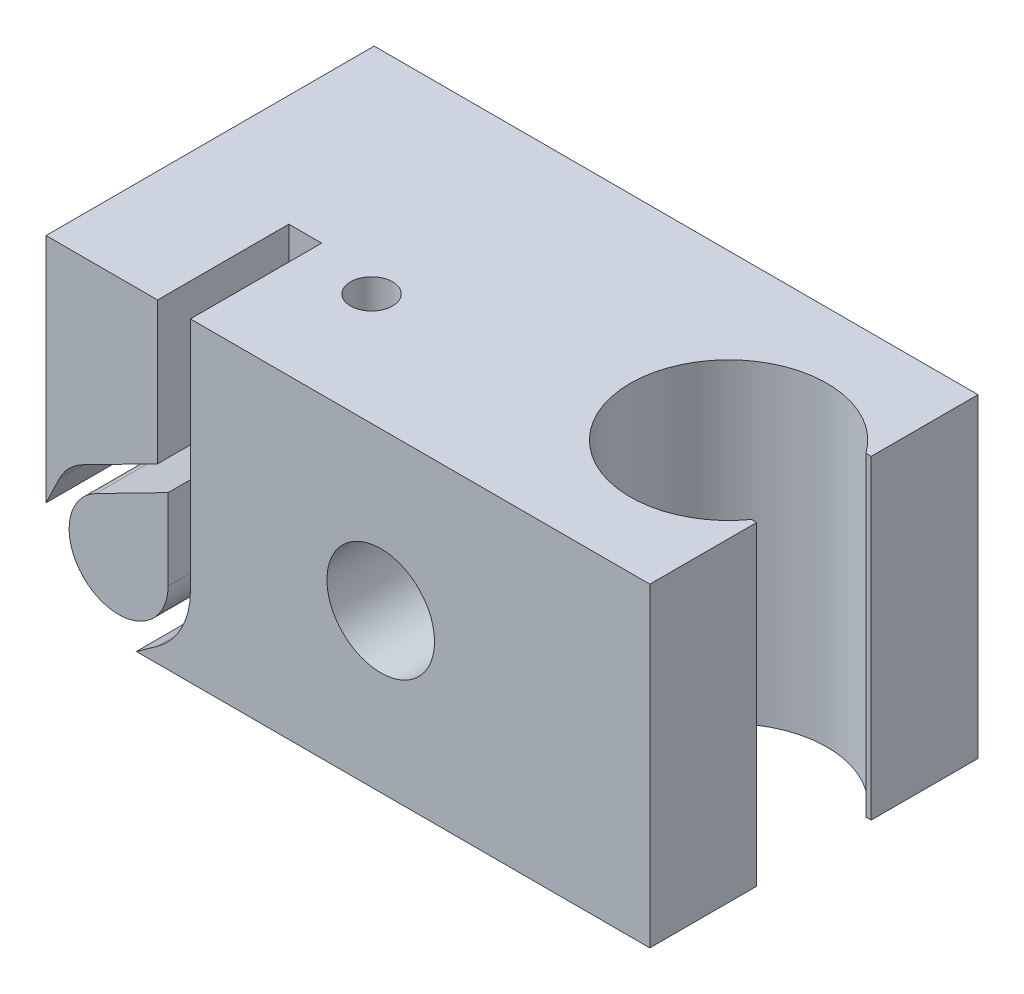
ISO-10303-21;
HEADER;
FILE_DESCRIPTION(('STEP AP214'),'2;1');
FILE_NAME('part.step','',(''),(''),'','','');
FILE_SCHEMA(('AUTOMOTIVE_DESIGN { 1 0 10303 214 1 1 1 1 }'));
ENDSEC;
DATA;
#1=APPLICATION_CONTEXT('core data for automotive mechanical design processes');
#2=APPLICATION_PROTOCOL_DEFINITION('international standard','automotive_design',2000,#1);
#3=PRODUCT_CONTEXT('',#1,'mechanical');
#4=PRODUCT('Part','Part','',(#3));
#5=PRODUCT_RELATED_PRODUCT_CATEGORY('part','',(#4));
#6=PRODUCT_DEFINITION_FORMATION('','',#4);
#7=PRODUCT_DEFINITION_CONTEXT('part definition',#1,'design');
#8=PRODUCT_DEFINITION('design','',#6,#7);
#9=PRODUCT_DEFINITION_SHAPE('','',#8);
#10=(LENGTH_UNIT() NAMED_UNIT(*) SI_UNIT(.MILLI.,.METRE.));
#11=(NAMED_UNIT(*) PLANE_ANGLE_UNIT() SI_UNIT($,.RADIAN.));
#12=(NAMED_UNIT(*) SI_UNIT($,.STERADIAN.) SOLID_ANGLE_UNIT());
#13=UNCERTAINTY_MEASURE_WITH_UNIT(LENGTH_MEASURE(1.E-05),#10,'distance_accuracy_value','');
#14=(GEOMETRIC_REPRESENTATION_CONTEXT(3) GLOBAL_UNCERTAINTY_ASSIGNED_CONTEXT((#13)) GLOBAL_UNIT_ASSIGNED_CONTEXT((#10,
#11,#12)) REPRESENTATION_CONTEXT('',''));
#15=CARTESIAN_POINT('',(0.,0.,0.));
#16=DIRECTION('',(0.,0.,1.));
#17=DIRECTION('',(1.,0.,0.));
#18=AXIS2_PLACEMENT_3D('',#15,#16,#17);
#19=CARTESIAN_POINT('',(0.,0.,2.5));
#20=DIRECTION('',(0.,0.,-1.));
#21=DIRECTION('',(-1.,0.,0.));
#22=AXIS2_PLACEMENT_3D('',#19,#20,#21);
#23=PLANE('',#22);
#24=DIRECTION('',(0.,1.,0.));
#25=VECTOR('',#24,1.);
#26=CARTESIAN_POINT('',(-31.,24.,2.5));
#27=LINE('',#26,#25);
#28=CARTESIAN_POINT('',(-31.,13.19,2.5));
#29=VERTEX_POINT('',#28);
#30=CARTESIAN_POINT('',(-31.,24.,2.5));
#31=VERTEX_POINT('',#30);
#32=EDGE_CURVE('E257',#29,#31,#27,.T.);
#33=ORIENTED_EDGE('',*,*,#32,.F.);
#34=DIRECTION('',(0.890531972902744,0.454920658178924,0.));
#35=VECTOR('',#34,1.);
#36=CARTESIAN_POINT('',(-31.,13.19,2.5));
#37=LINE('',#36,#35);
#38=CARTESIAN_POINT('',(-36.71,10.2730952315675,2.5));
#39=VERTEX_POINT('',#38);
#40=EDGE_CURVE('E262',#39,#29,#37,.T.);
#41=ORIENTED_EDGE('',*,*,#40,.F.);
#42=CARTESIAN_POINT('',(-34.8903173672843,6.71096733995649,2.5));
#43=DIRECTION('',(0.,0.,-1.));
#44=DIRECTION('',(1.,0.,0.));
#45=AXIS2_PLACEMENT_3D('',#42,#43,#44);
#46=CIRCLE('',#45,4.);
#47=CARTESIAN_POINT('',(-38.4926861378942,8.4496275254254,2.5));
#48=VERTEX_POINT('',#47);
#49=EDGE_CURVE('E278',#48,#39,#46,.T.);
#50=ORIENTED_EDGE('',*,*,#49,.F.);
#51=DIRECTION('',(0.434665046367225,0.900592192652467,0.));
#52=VECTOR('',#51,1.);
#53=CARTESIAN_POINT('',(-38.4926861378942,8.4496275254254,2.5));
#54=LINE('',#53,#52);
#55=CARTESIAN_POINT('',(-39.5,6.3625514944793,2.5));
#56=VERTEX_POINT('',#55);
#57=EDGE_CURVE('E276',#56,#48,#54,.T.);
#58=ORIENTED_EDGE('',*,*,#57,.F.);
#59=DIRECTION('',(0.,1.,0.));
#60=VECTOR('',#59,1.);
#61=CARTESIAN_POINT('',(-39.5,24.,2.50000000000001));
#62=LINE('',#61,#60);
#63=CARTESIAN_POINT('',(-39.5,0.,2.50000000000001));
#64=VERTEX_POINT('',#63);
#65=EDGE_CURVE('E323',#64,#56,#62,.T.);
#66=ORIENTED_EDGE('',*,*,#65,.F.);
#67=DIRECTION('',(-1.,0.,0.));
#68=VECTOR('',#67,1.);
#69=CARTESIAN_POINT('',(-20.,0.,2.5));
#70=LINE('',#69,#68);
#71=CARTESIAN_POINT('',(-32.618157490589,0.,2.5));
#72=VERTEX_POINT('',#71);
#73=EDGE_CURVE('E321',#72,#64,#70,.T.);
#74=ORIENTED_EDGE('',*,*,#73,.F.);
#75=DIRECTION('',(-0.814122037579976,-0.580693815987933,0.));
#76=VECTOR('',#75,1.);
#77=CARTESIAN_POINT('',(-31.0158371040724,1.14289688367537,2.5));
#78=LINE('',#77,#76);
#79=CARTESIAN_POINT('',(-31.0158371040724,1.14289688367537,2.5));
#80=VERTEX_POINT('',#79);
#81=EDGE_CURVE('E297',#80,#72,#78,.T.);
#82=ORIENTED_EDGE('',*,*,#81,.F.);
#83=CARTESIAN_POINT('',(-34.5,6.02762910915523,2.5));
#84=DIRECTION('',(0.,0.,-1.));
#85=DIRECTION('',(1.,0.,0.));
#86=AXIS2_PLACEMENT_3D('',#83,#84,#85);
#87=CIRCLE('',#86,6.);
#88=CARTESIAN_POINT('',(-28.5,6.02762910915523,2.5));
#89=VERTEX_POINT('',#88);
#90=EDGE_CURVE('E304',#89,#80,#87,.T.);
#91=ORIENTED_EDGE('',*,*,#90,.F.);
#92=DIRECTION('',(0.,-1.,0.));
#93=VECTOR('',#92,1.);
#94=CARTESIAN_POINT('',(-28.5,24.,2.5));
#95=LINE('',#94,#93);
#96=CARTESIAN_POINT('',(-28.5,24.,2.5));
#97=VERTEX_POINT('',#96);
#98=EDGE_CURVE('E293',#97,#89,#95,.T.);
#99=ORIENTED_EDGE('',*,*,#98,.F.);
#100=DIRECTION('',(1.,0.,0.));
#101=VECTOR('',#100,1.);
#102=CARTESIAN_POINT('',(-20.,24.,2.5));
#103=LINE('',#102,#101);
#104=EDGE_CURVE('E326',#31,#97,#103,.T.);
#105=ORIENTED_EDGE('',*,*,#104,.F.);
#106=EDGE_LOOP('',(#33,#41,#50,#58,#66,#74,#82,#91,#99,#105));
#107=FACE_BOUND('',#106,.T.);
#108=CARTESIAN_POINT('',(-33.97,5.5304048789427,2.5));
#109=DIRECTION('',(0.,0.,1.));
#110=DIRECTION('',(1.,0.,0.));
#111=AXIS2_PLACEMENT_3D('',#108,#109,#110);
#112=CIRCLE('',#111,3.77);
#113=CARTESIAN_POINT('',(-35.6850508813345,8.88771041678605,2.5));
#114=VERTEX_POINT('',#113);
#115=CARTESIAN_POINT('',(-30.2,5.5304048789427,2.5));
#116=VERTEX_POINT('',#115);
#117=EDGE_CURVE('E232',#114,#116,#112,.T.);
#118=ORIENTED_EDGE('',*,*,#117,.F.);
#119=DIRECTION('',(-0.890531972902744,-0.454920658178925,0.));
#120=VECTOR('',#119,1.);
#121=CARTESIAN_POINT('',(-30.2,11.6897018477598,2.5));
#122=LINE('',#121,#120);
#123=CARTESIAN_POINT('',(-30.2,11.6897018477598,2.5));
#124=VERTEX_POINT('',#123);
#125=EDGE_CURVE('E237',#124,#114,#122,.T.);
#126=ORIENTED_EDGE('',*,*,#125,.F.);
#127=DIRECTION('',(0.,1.,0.));
#128=VECTOR('',#127,1.);
#129=CARTESIAN_POINT('',(-30.2,5.5304048789427,2.5));
#130=LINE('',#129,#128);
#131=EDGE_CURVE('E244',#116,#124,#130,.T.);
#132=ORIENTED_EDGE('',*,*,#131,.F.);
#133=EDGE_LOOP('',(#118,#126,#132));
#134=FACE_BOUND('',#133,.T.);
#135=ADVANCED_FACE('F39',(#107,#134),#23,.F.);
#136=CARTESIAN_POINT('',(0.,24.,-12.5));
#137=DIRECTION('',(0.,0.,-1.));
#138=DIRECTION('',(-1.,0.,0.));
#139=AXIS2_PLACEMENT_3D('',#136,#137,#138);
#140=PLANE('',#139);
#141=CARTESIAN_POINT('',(-14.,12.,-12.5));
#142=DIRECTION('',(0.,0.,-1.));
#143=DIRECTION('',(-1.,0.,0.));
#144=AXIS2_PLACEMENT_3D('',#141,#142,#143);
#145=CIRCLE('',#144,4.1);
#146=CARTESIAN_POINT('',(-18.1,12.,-12.5));
#147=VERTEX_POINT('',#146);
#148=EDGE_CURVE('E339',#147,#147,#145,.T.);
#149=ORIENTED_EDGE('',*,*,#148,.F.);
#150=EDGE_LOOP('',(#149));
#151=FACE_BOUND('',#150,.T.);
#152=DIRECTION('',(0.,-1.,0.));
#153=VECTOR('',#152,1.);
#154=CARTESIAN_POINT('',(6.5,24.,-12.5));
#155=LINE('',#154,#153);
#156=CARTESIAN_POINT('',(6.5,24.,-12.5));
#157=VERTEX_POINT('',#156);
#158=CARTESIAN_POINT('',(6.5,0.,-12.5));
#159=VERTEX_POINT('',#158);
#160=EDGE_CURVE('E368',#157,#159,#155,.T.);
#161=ORIENTED_EDGE('',*,*,#160,.T.);
#162=DIRECTION('',(1.,0.,0.));
#163=VECTOR('',#162,1.);
#164=CARTESIAN_POINT('',(0.,0.,-12.5));
#165=LINE('',#164,#163);
#166=CARTESIAN_POINT('',(-39.5,0.,-12.5));
#167=VERTEX_POINT('',#166);
#168=EDGE_CURVE('E388',#167,#159,#165,.T.);
#169=ORIENTED_EDGE('',*,*,#168,.F.);
#170=DIRECTION('',(0.,1.,0.));
#171=VECTOR('',#170,1.);
#172=CARTESIAN_POINT('',(-39.5,24.,-12.5));
#173=LINE('',#172,#171);
#174=CARTESIAN_POINT('',(-39.5,24.,-12.5));
#175=VERTEX_POINT('',#174);
#176=EDGE_CURVE('E320',#167,#175,#173,.T.);
#177=ORIENTED_EDGE('',*,*,#176,.T.);
#178=DIRECTION('',(1.,0.,0.));
#179=VECTOR('',#178,1.);
#180=CARTESIAN_POINT('',(0.,24.,-12.5));
#181=LINE('',#180,#179);
#182=EDGE_CURVE('E48',#175,#157,#181,.T.);
#183=ORIENTED_EDGE('',*,*,#182,.T.);
#184=EDGE_LOOP('',(#161,#169,#177,#183));
#185=FACE_BOUND('',#184,.T.);
#186=ADVANCED_FACE('F421',(#151,#185),#140,.T.);
#187=CARTESIAN_POINT('',(0.,24.,0.));
#188=DIRECTION('',(0.,-1.,0.));
#189=DIRECTION('',(0.,0.,-1.));
#190=AXIS2_PLACEMENT_3D('',#187,#188,#189);
#191=CYLINDRICAL_SURFACE('',#190,7.5);
#192=DIRECTION('',(0.,-1.,0.));
#193=VECTOR('',#192,1.);
#194=CARTESIAN_POINT('',(6.1,24.,-4.36348484585429));
#195=LINE('',#194,#193);
#196=CARTESIAN_POINT('',(6.1,24.,-4.36348484585429));
#197=VERTEX_POINT('',#196);
#198=CARTESIAN_POINT('',(6.1,0.,-4.36348484585429));
#199=VERTEX_POINT('',#198);
#200=EDGE_CURVE('E374',#197,#199,#195,.T.);
#201=ORIENTED_EDGE('',*,*,#200,.F.);
#202=CARTESIAN_POINT('',(0.,24.,0.));
#203=DIRECTION('',(0.,1.,0.));
#204=DIRECTION('',(0.,0.,1.));
#205=AXIS2_PLACEMENT_3D('',#202,#203,#204);
#206=CIRCLE('',#205,7.5);
#207=CARTESIAN_POINT('',(6.1,24.,4.36348484585429));
#208=VERTEX_POINT('',#207);
#209=EDGE_CURVE('E382',#197,#208,#206,.T.);
#210=ORIENTED_EDGE('',*,*,#209,.T.);
#211=DIRECTION('',(0.,-1.,0.));
#212=VECTOR('',#211,1.);
#213=CARTESIAN_POINT('',(6.1,24.,4.36348484585429));
#214=LINE('',#213,#212);
#215=CARTESIAN_POINT('',(6.1,0.,4.36348484585429));
#216=VERTEX_POINT('',#215);
#217=EDGE_CURVE('E376',#208,#216,#214,.T.);
#218=ORIENTED_EDGE('',*,*,#217,.T.);
#219=CARTESIAN_POINT('',(0.,0.,0.));
#220=DIRECTION('',(0.,1.,0.));
#221=DIRECTION('',(0.,0.,1.));
#222=AXIS2_PLACEMENT_3D('',#219,#220,#221);
#223=CIRCLE('',#222,7.5);
#224=EDGE_CURVE('E371',#199,#216,#223,.T.);
#225=ORIENTED_EDGE('',*,*,#224,.F.);
#226=EDGE_LOOP('',(#201,#210,#218,#225));
#227=FACE_BOUND('',#226,.T.);
#228=ADVANCED_FACE('F41',(#227),#191,.F.);
#229=CARTESIAN_POINT('',(0.,24.,12.5));
#230=DIRECTION('',(0.,0.,1.));
#231=DIRECTION('',(1.,0.,0.));
#232=AXIS2_PLACEMENT_3D('',#229,#230,#231);
#233=PLANE('',#232);
#234=CARTESIAN_POINT('',(-14.,12.,12.5));
#235=DIRECTION('',(0.,0.,1.));
#236=DIRECTION('',(1.,0.,0.));
#237=AXIS2_PLACEMENT_3D('',#234,#235,#236);
#238=CIRCLE('',#237,4.1);
#239=CARTESIAN_POINT('',(-9.9,12.,12.5));
#240=VERTEX_POINT('',#239);
#241=EDGE_CURVE('E334',#240,#240,#238,.T.);
#242=ORIENTED_EDGE('',*,*,#241,.F.);
#243=EDGE_LOOP('',(#242));
#244=FACE_BOUND('',#243,.T.);
#245=DIRECTION('',(0.,-1.,0.));
#246=VECTOR('',#245,1.);
#247=CARTESIAN_POINT('',(6.5,24.,12.5));
#248=LINE('',#247,#246);
#249=CARTESIAN_POINT('',(6.5,24.,12.5));
#250=VERTEX_POINT('',#249);
#251=CARTESIAN_POINT('',(6.5,0.,12.5));
#252=VERTEX_POINT('',#251);
#253=EDGE_CURVE('E359',#250,#252,#248,.T.);
#254=ORIENTED_EDGE('',*,*,#253,.F.);
#255=DIRECTION('',(-1.,0.,0.));
#256=VECTOR('',#255,1.);
#257=CARTESIAN_POINT('',(0.,24.,12.5));
#258=LINE('',#257,#256);
#259=CARTESIAN_POINT('',(-28.5,24.,12.5));
#260=VERTEX_POINT('',#259);
#261=EDGE_CURVE('E11',#250,#260,#258,.T.);
#262=ORIENTED_EDGE('',*,*,#261,.T.);
#263=DIRECTION('',(0.,-1.,0.));
#264=VECTOR('',#263,1.);
#265=CARTESIAN_POINT('',(-28.5,24.,12.5));
#266=LINE('',#265,#264);
#267=CARTESIAN_POINT('',(-28.5,6.02762910915523,12.5));
#268=VERTEX_POINT('',#267);
#269=EDGE_CURVE('E294',#260,#268,#266,.T.);
#270=ORIENTED_EDGE('',*,*,#269,.T.);
#271=CARTESIAN_POINT('',(-34.5,6.02762910915523,12.5));
#272=DIRECTION('',(0.,0.,-1.));
#273=DIRECTION('',(1.,0.,0.));
#274=AXIS2_PLACEMENT_3D('',#271,#272,#273);
#275=CIRCLE('',#274,6.);
#276=CARTESIAN_POINT('',(-31.0158371040724,1.14289688367537,12.5));
#277=VERTEX_POINT('',#276);
#278=EDGE_CURVE('E296',#268,#277,#275,.T.);
#279=ORIENTED_EDGE('',*,*,#278,.T.);
#280=DIRECTION('',(-0.814122037579976,-0.580693815987933,0.));
#281=VECTOR('',#280,1.);
#282=CARTESIAN_POINT('',(-31.0158371040724,1.14289688367537,12.5));
#283=LINE('',#282,#281);
#284=CARTESIAN_POINT('',(-32.618157490589,0.,12.5));
#285=VERTEX_POINT('',#284);
#286=EDGE_CURVE('E299',#277,#285,#283,.T.);
#287=ORIENTED_EDGE('',*,*,#286,.T.);
#288=DIRECTION('',(-1.,0.,0.));
#289=VECTOR('',#288,1.);
#290=CARTESIAN_POINT('',(0.,0.,12.5));
#291=LINE('',#290,#289);
#292=EDGE_CURVE('E43',#252,#285,#291,.T.);
#293=ORIENTED_EDGE('',*,*,#292,.F.);
#294=EDGE_LOOP('',(#254,#262,#270,#279,#287,#293));
#295=FACE_BOUND('',#294,.T.);
#296=ADVANCED_FACE('F401',(#244,#295),#233,.T.);
#297=CARTESIAN_POINT('',(0.,24.,0.));
#298=DIRECTION('',(0.,1.,0.));
#299=DIRECTION('',(0.,0.,1.));
#300=AXIS2_PLACEMENT_3D('',#297,#298,#299);
#301=PLANE('',#300);
#302=DIRECTION('',(0.,0.,-1.));
#303=VECTOR('',#302,1.);
#304=CARTESIAN_POINT('',(-28.5,24.,12.5));
#305=LINE('',#304,#303);
#306=EDGE_CURVE('E317',#260,#97,#305,.T.);
#307=ORIENTED_EDGE('',*,*,#306,.F.);
#308=ORIENTED_EDGE('',*,*,#261,.F.);
#309=DIRECTION('',(0.,0.,-1.));
#310=VECTOR('',#309,1.);
#311=CARTESIAN_POINT('',(6.5,24.,12.5));
#312=LINE('',#311,#310);
#313=CARTESIAN_POINT('',(6.5,24.,4.36348484585429));
#314=VERTEX_POINT('',#313);
#315=EDGE_CURVE('E346',#250,#314,#312,.T.);
#316=ORIENTED_EDGE('',*,*,#315,.T.);
#317=DIRECTION('',(-1.,0.,0.));
#318=VECTOR('',#317,1.);
#319=CARTESIAN_POINT('',(6.5,24.,4.36348484585429));
#320=LINE('',#319,#318);
#321=EDGE_CURVE('E349',#314,#208,#320,.T.);
#322=ORIENTED_EDGE('',*,*,#321,.T.);
#323=ORIENTED_EDGE('',*,*,#209,.F.);
#324=DIRECTION('',(1.,0.,0.));
#325=VECTOR('',#324,1.);
#326=CARTESIAN_POINT('',(6.5,24.,-4.36348484585429));
#327=LINE('',#326,#325);
#328=CARTESIAN_POINT('',(6.5,24.,-4.36348484585429));
#329=VERTEX_POINT('',#328);
#330=EDGE_CURVE('E353',#197,#329,#327,.T.);
#331=ORIENTED_EDGE('',*,*,#330,.T.);
#332=DIRECTION('',(0.,0.,-1.));
#333=VECTOR('',#332,1.);
#334=CARTESIAN_POINT('',(6.5,24.,-4.36348484585429));
#335=LINE('',#334,#333);
#336=EDGE_CURVE('E356',#329,#157,#335,.T.);
#337=ORIENTED_EDGE('',*,*,#336,.T.);
#338=ORIENTED_EDGE('',*,*,#182,.F.);
#339=DIRECTION('',(0.,0.,-1.));
#340=VECTOR('',#339,1.);
#341=CARTESIAN_POINT('',(-39.5,24.,2.50000000000001));
#342=LINE('',#341,#340);
#343=CARTESIAN_POINT('',(-39.5,24.,12.5));
#344=VERTEX_POINT('',#343);
#345=EDGE_CURVE('E331',#344,#175,#342,.T.);
#346=ORIENTED_EDGE('',*,*,#345,.F.);
#347=DIRECTION('',(-1.,0.,0.));
#348=VECTOR('',#347,1.);
#349=CARTESIAN_POINT('',(-31.,24.,12.5));
#350=LINE('',#349,#348);
#351=CARTESIAN_POINT('',(-31.,24.,12.5));
#352=VERTEX_POINT('',#351);
#353=EDGE_CURVE('E261',#352,#344,#350,.T.);
#354=ORIENTED_EDGE('',*,*,#353,.F.);
#355=DIRECTION('',(0.,0.,-1.));
#356=VECTOR('',#355,1.);
#357=CARTESIAN_POINT('',(-31.,24.,12.5));
#358=LINE('',#357,#356);
#359=EDGE_CURVE('E291',#352,#31,#358,.T.);
#360=ORIENTED_EDGE('',*,*,#359,.T.);
#361=ORIENTED_EDGE('',*,*,#104,.T.);
#362=EDGE_LOOP('',(#307,#308,#316,#322,#323,#331,#337,#338,#346,#354,#360,#361));
#363=FACE_BOUND('',#362,.T.);
#364=CARTESIAN_POINT('',(-23.25,24.,3.95));
#365=DIRECTION('',(0.,1.,0.));
#366=DIRECTION('',(0.,0.,1.));
#367=AXIS2_PLACEMENT_3D('',#364,#365,#366);
#368=CIRCLE('',#367,1.6);
#369=CARTESIAN_POINT('',(-23.25,24.,5.55));
#370=VERTEX_POINT('',#369);
#371=EDGE_CURVE('E716',#370,#370,#368,.T.);
#372=ORIENTED_EDGE('',*,*,#371,.F.);
#373=EDGE_LOOP('',(#372));
#374=FACE_BOUND('',#373,.T.);
#375=ADVANCED_FACE('F427',(#363,#374),#301,.T.);
#376=CARTESIAN_POINT('',(0.,0.,0.));
#377=DIRECTION('',(0.,1.,0.));
#378=DIRECTION('',(0.,0.,1.));
#379=AXIS2_PLACEMENT_3D('',#376,#377,#378);
#380=PLANE('',#379);
#381=ORIENTED_EDGE('',*,*,#292,.T.);
#382=DIRECTION('',(0.,0.,-1.));
#383=VECTOR('',#382,1.);
#384=CARTESIAN_POINT('',(-32.618157490589,0.,12.5));
#385=LINE('',#384,#383);
#386=EDGE_CURVE('E309',#285,#72,#385,.T.);
#387=ORIENTED_EDGE('',*,*,#386,.T.);
#388=ORIENTED_EDGE('',*,*,#73,.T.);
#389=DIRECTION('',(0.,0.,-1.));
#390=VECTOR('',#389,1.);
#391=CARTESIAN_POINT('',(-39.5,0.,2.50000000000001));
#392=LINE('',#391,#390);
#393=EDGE_CURVE('E328',#64,#167,#392,.T.);
#394=ORIENTED_EDGE('',*,*,#393,.T.);
#395=ORIENTED_EDGE('',*,*,#168,.T.);
#396=DIRECTION('',(0.,0.,-1.));
#397=VECTOR('',#396,1.);
#398=CARTESIAN_POINT('',(6.5,0.,-4.36348484585429));
#399=LINE('',#398,#397);
#400=CARTESIAN_POINT('',(6.5,0.,-4.36348484585429));
#401=VERTEX_POINT('',#400);
#402=EDGE_CURVE('E350',#401,#159,#399,.T.);
#403=ORIENTED_EDGE('',*,*,#402,.F.);
#404=DIRECTION('',(1.,0.,0.));
#405=VECTOR('',#404,1.);
#406=CARTESIAN_POINT('',(6.5,0.,-4.36348484585429));
#407=LINE('',#406,#405);
#408=EDGE_CURVE('E364',#199,#401,#407,.T.);
#409=ORIENTED_EDGE('',*,*,#408,.F.);
#410=ORIENTED_EDGE('',*,*,#224,.T.);
#411=DIRECTION('',(-1.,0.,0.));
#412=VECTOR('',#411,1.);
#413=CARTESIAN_POINT('',(6.5,0.,4.36348484585429));
#414=LINE('',#413,#412);
#415=CARTESIAN_POINT('',(6.5,0.,4.36348484585429));
#416=VERTEX_POINT('',#415);
#417=EDGE_CURVE('E362',#416,#216,#414,.T.);
#418=ORIENTED_EDGE('',*,*,#417,.F.);
#419=DIRECTION('',(0.,0.,-1.));
#420=VECTOR('',#419,1.);
#421=CARTESIAN_POINT('',(6.5,0.,12.5));
#422=LINE('',#421,#420);
#423=EDGE_CURVE('E345',#252,#416,#422,.T.);
#424=ORIENTED_EDGE('',*,*,#423,.F.);
#425=EDGE_LOOP('',(#381,#387,#388,#394,#395,#403,#409,#410,#418,#424));
#426=FACE_BOUND('',#425,.T.);
#427=DIRECTION('',(0.,0.,1.));
#428=VECTOR('',#427,1.);
#429=CARTESIAN_POINT('',(-20.,0.,0.));
#430=LINE('',#429,#428);
#431=CARTESIAN_POINT('',(-20.,0.,-2.8));
#432=VERTEX_POINT('',#431);
#433=CARTESIAN_POINT('',(-20.,0.,10.7));
#434=VERTEX_POINT('',#433);
#435=EDGE_CURVE('E342',#432,#434,#430,.T.);
#436=ORIENTED_EDGE('',*,*,#435,.F.);
#437=DIRECTION('',(1.,0.,0.));
#438=VECTOR('',#437,1.);
#439=CARTESIAN_POINT('',(-20.,0.,-2.8));
#440=LINE('',#439,#438);
#441=CARTESIAN_POINT('',(-26.5,0.,-2.8));
#442=VERTEX_POINT('',#441);
#443=EDGE_CURVE('E229',#442,#432,#440,.T.);
#444=ORIENTED_EDGE('',*,*,#443,.F.);
#445=DIRECTION('',(0.,0.,-1.));
#446=VECTOR('',#445,1.);
#447=CARTESIAN_POINT('',(-26.5,0.,12.5));
#448=LINE('',#447,#446);
#449=CARTESIAN_POINT('',(-26.5,0.,10.7));
#450=VERTEX_POINT('',#449);
#451=EDGE_CURVE('E302',#450,#442,#448,.T.);
#452=ORIENTED_EDGE('',*,*,#451,.F.);
#453=DIRECTION('',(1.,0.,0.));
#454=VECTOR('',#453,1.);
#455=CARTESIAN_POINT('',(-20.,0.,10.7));
#456=LINE('',#455,#454);
#457=EDGE_CURVE('E208',#450,#434,#456,.T.);
#458=ORIENTED_EDGE('',*,*,#457,.T.);
#459=EDGE_LOOP('',(#436,#444,#452,#458));
#460=FACE_BOUND('',#459,.T.);
#461=ADVANCED_FACE('F394',(#426,#460),#380,.F.);
#462=CARTESIAN_POINT('',(6.5,24.,12.5));
#463=DIRECTION('',(-1.,0.,0.));
#464=DIRECTION('',(0.,0.,1.));
#465=AXIS2_PLACEMENT_3D('',#462,#463,#464);
#466=PLANE('',#465);
#467=ORIENTED_EDGE('',*,*,#423,.T.);
#468=DIRECTION('',(0.,-1.,0.));
#469=VECTOR('',#468,1.);
#470=CARTESIAN_POINT('',(6.5,24.,4.36348484585429));
#471=LINE('',#470,#469);
#472=EDGE_CURVE('E379',#314,#416,#471,.T.);
#473=ORIENTED_EDGE('',*,*,#472,.F.);
#474=ORIENTED_EDGE('',*,*,#315,.F.);
#475=ORIENTED_EDGE('',*,*,#253,.T.);
#476=EDGE_LOOP('',(#467,#473,#474,#475));
#477=FACE_BOUND('',#476,.T.);
#478=ADVANCED_FACE('F440',(#477),#466,.F.);
#479=CARTESIAN_POINT('',(6.5,24.,4.36348484585429));
#480=DIRECTION('',(0.,0.,1.));
#481=DIRECTION('',(1.,0.,0.));
#482=AXIS2_PLACEMENT_3D('',#479,#480,#481);
#483=PLANE('',#482);
#484=ORIENTED_EDGE('',*,*,#417,.T.);
#485=ORIENTED_EDGE('',*,*,#217,.F.);
#486=ORIENTED_EDGE('',*,*,#321,.F.);
#487=ORIENTED_EDGE('',*,*,#472,.T.);
#488=EDGE_LOOP('',(#484,#485,#486,#487));
#489=FACE_BOUND('',#488,.T.);
#490=ADVANCED_FACE('F437',(#489),#483,.F.);
#491=CARTESIAN_POINT('',(6.5,24.,-4.36348484585429));
#492=DIRECTION('',(-1.,0.,0.));
#493=DIRECTION('',(0.,0.,1.));
#494=AXIS2_PLACEMENT_3D('',#491,#492,#493);
#495=PLANE('',#494);
#496=ORIENTED_EDGE('',*,*,#402,.T.);
#497=ORIENTED_EDGE('',*,*,#160,.F.);
#498=ORIENTED_EDGE('',*,*,#336,.F.);
#499=DIRECTION('',(0.,-1.,0.));
#500=VECTOR('',#499,1.);
#501=CARTESIAN_POINT('',(6.5,24.,-4.36348484585429));
#502=LINE('',#501,#500);
#503=EDGE_CURVE('E372',#329,#401,#502,.T.);
#504=ORIENTED_EDGE('',*,*,#503,.T.);
#505=EDGE_LOOP('',(#496,#497,#498,#504));
#506=FACE_BOUND('',#505,.T.);
#507=ADVANCED_FACE('F424',(#506),#495,.F.);
#508=CARTESIAN_POINT('',(6.5,24.,-4.36348484585429));
#509=DIRECTION('',(0.,0.,-1.));
#510=DIRECTION('',(-1.,0.,0.));
#511=AXIS2_PLACEMENT_3D('',#508,#509,#510);
#512=PLANE('',#511);
#513=ORIENTED_EDGE('',*,*,#408,.T.);
#514=ORIENTED_EDGE('',*,*,#503,.F.);
#515=ORIENTED_EDGE('',*,*,#330,.F.);
#516=ORIENTED_EDGE('',*,*,#200,.T.);
#517=EDGE_LOOP('',(#513,#514,#515,#516));
#518=FACE_BOUND('',#517,.T.);
#519=ADVANCED_FACE('F432',(#518),#512,.F.);
#520=CARTESIAN_POINT('',(-20.,24.,0.));
#521=DIRECTION('',(1.,0.,0.));
#522=DIRECTION('',(0.,0.,-1.));
#523=AXIS2_PLACEMENT_3D('',#520,#521,#522);
#524=PLANE('',#523);
#525=DIRECTION('',(0.,-1.,0.));
#526=VECTOR('',#525,1.);
#527=CARTESIAN_POINT('',(-20.,30.7446274915669,10.7));
#528=LINE('',#527,#526);
#529=CARTESIAN_POINT('',(-20.,19.,10.7));
#530=VERTEX_POINT('',#529);
#531=EDGE_CURVE('E212',#530,#434,#528,.T.);
#532=ORIENTED_EDGE('',*,*,#531,.F.);
#533=DIRECTION('',(0.,0.,-1.));
#534=VECTOR('',#533,1.);
#535=CARTESIAN_POINT('',(-20.,19.,-2.8));
#536=LINE('',#535,#534);
#537=CARTESIAN_POINT('',(-20.,19.,-2.8));
#538=VERTEX_POINT('',#537);
#539=EDGE_CURVE('E64',#530,#538,#536,.T.);
#540=ORIENTED_EDGE('',*,*,#539,.T.);
#541=DIRECTION('',(0.,1.,0.));
#542=VECTOR('',#541,1.);
#543=CARTESIAN_POINT('',(-20.,24.,-2.8));
#544=LINE('',#543,#542);
#545=EDGE_CURVE('E225',#432,#538,#544,.T.);
#546=ORIENTED_EDGE('',*,*,#545,.F.);
#547=ORIENTED_EDGE('',*,*,#435,.T.);
#548=EDGE_LOOP('',(#532,#540,#546,#547));
#549=FACE_BOUND('',#548,.T.);
#550=ADVANCED_FACE('F495',(#549),#524,.F.);
#551=CARTESIAN_POINT('',(-14.,12.,-35.5));
#552=DIRECTION('',(0.,0.,1.));
#553=DIRECTION('',(1.,0.,0.));
#554=AXIS2_PLACEMENT_3D('',#551,#552,#553);
#555=CYLINDRICAL_SURFACE('',#554,4.1);
#556=ORIENTED_EDGE('',*,*,#148,.T.);
#557=EDGE_LOOP('',(#556));
#558=FACE_BOUND('',#557,.T.);
#559=ORIENTED_EDGE('',*,*,#241,.T.);
#560=EDGE_LOOP('',(#559));
#561=FACE_BOUND('',#560,.T.);
#562=ADVANCED_FACE('F492',(#558,#561),#555,.F.);
#563=CARTESIAN_POINT('',(-39.5,24.,2.50000000000001));
#564=DIRECTION('',(-1.,0.,0.));
#565=DIRECTION('',(0.,0.,1.));
#566=AXIS2_PLACEMENT_3D('',#563,#564,#565);
#567=PLANE('',#566);
#568=ORIENTED_EDGE('',*,*,#176,.F.);
#569=ORIENTED_EDGE('',*,*,#393,.F.);
#570=ORIENTED_EDGE('',*,*,#65,.T.);
#571=DIRECTION('',(0.,0.,-1.));
#572=VECTOR('',#571,1.);
#573=CARTESIAN_POINT('',(-39.5,6.3625514944793,12.5));
#574=LINE('',#573,#572);
#575=CARTESIAN_POINT('',(-39.5,6.3625514944793,12.5));
#576=VERTEX_POINT('',#575);
#577=EDGE_CURVE('E289',#576,#56,#574,.T.);
#578=ORIENTED_EDGE('',*,*,#577,.F.);
#579=DIRECTION('',(0.,-1.,0.));
#580=VECTOR('',#579,1.);
#581=CARTESIAN_POINT('',(-39.5,24.,12.5));
#582=LINE('',#581,#580);
#583=EDGE_CURVE('E265',#344,#576,#582,.T.);
#584=ORIENTED_EDGE('',*,*,#583,.F.);
#585=ORIENTED_EDGE('',*,*,#345,.T.);
#586=EDGE_LOOP('',(#568,#569,#570,#578,#584,#585));
#587=FACE_BOUND('',#586,.T.);
#588=ADVANCED_FACE('F417',(#587),#567,.T.);
#589=CARTESIAN_POINT('',(-26.5,24.,12.5));
#590=DIRECTION('',(-1.,0.,0.));
#591=DIRECTION('',(0.,-1.,0.));
#592=AXIS2_PLACEMENT_3D('',#589,#590,#591);
#593=PLANE('',#592);
#594=DIRECTION('',(0.,-1.,0.));
#595=VECTOR('',#594,1.);
#596=CARTESIAN_POINT('',(-26.5,24.,-2.8));
#597=LINE('',#596,#595);
#598=CARTESIAN_POINT('',(-26.5,19.,-2.8));
#599=VERTEX_POINT('',#598);
#600=EDGE_CURVE('E217',#599,#442,#597,.T.);
#601=ORIENTED_EDGE('',*,*,#600,.F.);
#602=DIRECTION('',(0.,0.,1.));
#603=VECTOR('',#602,1.);
#604=CARTESIAN_POINT('',(-26.5,19.,-2.8));
#605=LINE('',#604,#603);
#606=CARTESIAN_POINT('',(-26.5,19.,10.7));
#607=VERTEX_POINT('',#606);
#608=EDGE_CURVE('E215',#599,#607,#605,.T.);
#609=ORIENTED_EDGE('',*,*,#608,.T.);
#610=DIRECTION('',(0.,-1.,0.));
#611=VECTOR('',#610,1.);
#612=CARTESIAN_POINT('',(-26.5,30.7446274915669,10.7));
#613=LINE('',#612,#611);
#614=EDGE_CURVE('E202',#607,#450,#613,.T.);
#615=ORIENTED_EDGE('',*,*,#614,.T.);
#616=ORIENTED_EDGE('',*,*,#451,.T.);
#617=EDGE_LOOP('',(#601,#609,#615,#616));
#618=FACE_BOUND('',#617,.T.);
#619=ADVANCED_FACE('F216',(#618),#593,.F.);
#620=CARTESIAN_POINT('',(-28.5,24.,12.5));
#621=DIRECTION('',(1.,0.,0.));
#622=DIRECTION('',(0.,1.,0.));
#623=AXIS2_PLACEMENT_3D('',#620,#621,#622);
#624=PLANE('',#623);
#625=ORIENTED_EDGE('',*,*,#98,.T.);
#626=DIRECTION('',(0.,0.,-1.));
#627=VECTOR('',#626,1.);
#628=CARTESIAN_POINT('',(-28.5,6.02762910915523,12.5));
#629=LINE('',#628,#627);
#630=EDGE_CURVE('E314',#268,#89,#629,.T.);
#631=ORIENTED_EDGE('',*,*,#630,.F.);
#632=ORIENTED_EDGE('',*,*,#269,.F.);
#633=ORIENTED_EDGE('',*,*,#306,.T.);
#634=EDGE_LOOP('',(#625,#631,#632,#633));
#635=FACE_BOUND('',#634,.T.);
#636=ADVANCED_FACE('F447',(#635),#624,.F.);
#637=CARTESIAN_POINT('',(-34.5,6.02762910915523,12.5));
#638=DIRECTION('',(0.,0.,-1.));
#639=DIRECTION('',(-1.,0.,0.));
#640=AXIS2_PLACEMENT_3D('',#637,#638,#639);
#641=CYLINDRICAL_SURFACE('',#640,6.);
#642=ORIENTED_EDGE('',*,*,#90,.T.);
#643=DIRECTION('',(0.,0.,-1.));
#644=VECTOR('',#643,1.);
#645=CARTESIAN_POINT('',(-31.0158371040724,1.14289688367537,12.5));
#646=LINE('',#645,#644);
#647=EDGE_CURVE('E311',#277,#80,#646,.T.);
#648=ORIENTED_EDGE('',*,*,#647,.F.);
#649=ORIENTED_EDGE('',*,*,#278,.F.);
#650=ORIENTED_EDGE('',*,*,#630,.T.);
#651=EDGE_LOOP('',(#642,#648,#649,#650));
#652=FACE_BOUND('',#651,.T.);
#653=ADVANCED_FACE('F449',(#652),#641,.F.);
#654=CARTESIAN_POINT('',(-31.0158371040724,1.14289688367537,12.5));
#655=DIRECTION('',(0.580693815987933,-0.814122037579976,0.));
#656=DIRECTION('',(0.814122037579976,0.580693815987933,0.));
#657=AXIS2_PLACEMENT_3D('',#654,#655,#656);
#658=PLANE('',#657);
#659=ORIENTED_EDGE('',*,*,#81,.T.);
#660=ORIENTED_EDGE('',*,*,#386,.F.);
#661=ORIENTED_EDGE('',*,*,#286,.F.);
#662=ORIENTED_EDGE('',*,*,#647,.T.);
#663=EDGE_LOOP('',(#659,#660,#661,#662));
#664=FACE_BOUND('',#663,.T.);
#665=ADVANCED_FACE('F405',(#664),#658,.F.);
#666=CARTESIAN_POINT('',(-31.,24.,12.5));
#667=DIRECTION('',(-1.,0.,0.));
#668=DIRECTION('',(0.,-1.,0.));
#669=AXIS2_PLACEMENT_3D('',#666,#667,#668);
#670=PLANE('',#669);
#671=ORIENTED_EDGE('',*,*,#32,.T.);
#672=ORIENTED_EDGE('',*,*,#359,.F.);
#673=DIRECTION('',(0.,1.,0.));
#674=VECTOR('',#673,1.);
#675=CARTESIAN_POINT('',(-31.,24.,12.5));
#676=LINE('',#675,#674);
#677=CARTESIAN_POINT('',(-31.,13.19,12.5));
#678=VERTEX_POINT('',#677);
#679=EDGE_CURVE('E258',#678,#352,#676,.T.);
#680=ORIENTED_EDGE('',*,*,#679,.F.);
#681=DIRECTION('',(0.,0.,-1.));
#682=VECTOR('',#681,1.);
#683=CARTESIAN_POINT('',(-31.,13.19,12.5));
#684=LINE('',#683,#682);
#685=EDGE_CURVE('E273',#678,#29,#684,.T.);
#686=ORIENTED_EDGE('',*,*,#685,.T.);
#687=EDGE_LOOP('',(#671,#672,#680,#686));
#688=FACE_BOUND('',#687,.T.);
#689=ADVANCED_FACE('F454',(#688),#670,.F.);
#690=CARTESIAN_POINT('',(-38.4926861378942,8.4496275254254,12.5));
#691=DIRECTION('',(-0.900592192652467,0.434665046367225,0.));
#692=DIRECTION('',(-0.434665046367225,-0.900592192652467,0.));
#693=AXIS2_PLACEMENT_3D('',#690,#691,#692);
#694=PLANE('',#693);
#695=ORIENTED_EDGE('',*,*,#57,.T.);
#696=DIRECTION('',(0.,0.,-1.));
#697=VECTOR('',#696,1.);
#698=CARTESIAN_POINT('',(-38.4926861378942,8.4496275254254,12.5));
#699=LINE('',#698,#697);
#700=CARTESIAN_POINT('',(-38.4926861378942,8.4496275254254,12.5));
#701=VERTEX_POINT('',#700);
#702=EDGE_CURVE('E286',#701,#48,#699,.T.);
#703=ORIENTED_EDGE('',*,*,#702,.F.);
#704=DIRECTION('',(0.434665046367225,0.900592192652467,0.));
#705=VECTOR('',#704,1.);
#706=CARTESIAN_POINT('',(-38.4926861378942,8.4496275254254,12.5));
#707=LINE('',#706,#705);
#708=EDGE_CURVE('E267',#576,#701,#707,.T.);
#709=ORIENTED_EDGE('',*,*,#708,.F.);
#710=ORIENTED_EDGE('',*,*,#577,.T.);
#711=EDGE_LOOP('',(#695,#703,#709,#710));
#712=FACE_BOUND('',#711,.T.);
#713=ADVANCED_FACE('F466',(#712),#694,.F.);
#714=CARTESIAN_POINT('',(-34.8903173672843,6.71096733995649,12.5));
#715=DIRECTION('',(0.,0.,-1.));
#716=DIRECTION('',(-1.,0.,0.));
#717=AXIS2_PLACEMENT_3D('',#714,#715,#716);
#718=CYLINDRICAL_SURFACE('',#717,4.);
#719=ORIENTED_EDGE('',*,*,#49,.T.);
#720=DIRECTION('',(0.,0.,-1.));
#721=VECTOR('',#720,1.);
#722=CARTESIAN_POINT('',(-36.71,10.2730952315675,12.5));
#723=LINE('',#722,#721);
#724=CARTESIAN_POINT('',(-36.71,10.2730952315675,12.5));
#725=VERTEX_POINT('',#724);
#726=EDGE_CURVE('E283',#725,#39,#723,.T.);
#727=ORIENTED_EDGE('',*,*,#726,.F.);
#728=CARTESIAN_POINT('',(-34.8903173672843,6.71096733995649,12.5));
#729=DIRECTION('',(0.,0.,-1.));
#730=DIRECTION('',(1.,0.,0.));
#731=AXIS2_PLACEMENT_3D('',#728,#729,#730);
#732=CIRCLE('',#731,4.);
#733=EDGE_CURVE('E269',#701,#725,#732,.T.);
#734=ORIENTED_EDGE('',*,*,#733,.F.);
#735=ORIENTED_EDGE('',*,*,#702,.T.);
#736=EDGE_LOOP('',(#719,#727,#734,#735));
#737=FACE_BOUND('',#736,.T.);
#738=ADVANCED_FACE('F463',(#737),#718,.F.);
#739=CARTESIAN_POINT('',(-31.,13.19,12.5));
#740=DIRECTION('',(-0.454920658178924,0.890531972902744,0.));
#741=DIRECTION('',(-0.890531972902744,-0.454920658178924,0.));
#742=AXIS2_PLACEMENT_3D('',#739,#740,#741);
#743=PLANE('',#742);
#744=ORIENTED_EDGE('',*,*,#40,.T.);
#745=ORIENTED_EDGE('',*,*,#685,.F.);
#746=DIRECTION('',(0.890531972902744,0.454920658178924,0.));
#747=VECTOR('',#746,1.);
#748=CARTESIAN_POINT('',(-31.,13.19,12.5));
#749=LINE('',#748,#747);
#750=EDGE_CURVE('E271',#725,#678,#749,.T.);
#751=ORIENTED_EDGE('',*,*,#750,.F.);
#752=ORIENTED_EDGE('',*,*,#726,.T.);
#753=EDGE_LOOP('',(#744,#745,#751,#752));
#754=FACE_BOUND('',#753,.T.);
#755=ADVANCED_FACE('F459',(#754),#743,.F.);
#756=CARTESIAN_POINT('',(-34.8903173672843,6.71096733995649,12.5));
#757=DIRECTION('',(0.,0.,1.));
#758=DIRECTION('',(1.,0.,0.));
#759=AXIS2_PLACEMENT_3D('',#756,#757,#758);
#760=PLANE('',#759);
#761=ORIENTED_EDGE('',*,*,#679,.T.);
#762=ORIENTED_EDGE('',*,*,#353,.T.);
#763=ORIENTED_EDGE('',*,*,#583,.T.);
#764=ORIENTED_EDGE('',*,*,#708,.T.);
#765=ORIENTED_EDGE('',*,*,#733,.T.);
#766=ORIENTED_EDGE('',*,*,#750,.T.);
#767=EDGE_LOOP('',(#761,#762,#763,#764,#765,#766));
#768=FACE_BOUND('',#767,.T.);
#769=ADVANCED_FACE('F469',(#768),#760,.T.);
#770=CARTESIAN_POINT('',(-33.97,5.5304048789427,12.5));
#771=DIRECTION('',(0.,0.,-1.));
#772=DIRECTION('',(-1.,0.,0.));
#773=AXIS2_PLACEMENT_3D('',#770,#771,#772);
#774=CYLINDRICAL_SURFACE('',#773,3.77);
#775=ORIENTED_EDGE('',*,*,#117,.T.);
#776=DIRECTION('',(0.,0.,-1.));
#777=VECTOR('',#776,1.);
#778=CARTESIAN_POINT('',(-30.2,5.5304048789427,12.5));
#779=LINE('',#778,#777);
#780=CARTESIAN_POINT('',(-30.2,5.5304048789427,12.5));
#781=VERTEX_POINT('',#780);
#782=EDGE_CURVE('E254',#781,#116,#779,.T.);
#783=ORIENTED_EDGE('',*,*,#782,.F.);
#784=CARTESIAN_POINT('',(-33.97,5.5304048789427,12.5));
#785=DIRECTION('',(0.,0.,1.));
#786=DIRECTION('',(1.,0.,0.));
#787=AXIS2_PLACEMENT_3D('',#784,#785,#786);
#788=CIRCLE('',#787,3.77);
#789=CARTESIAN_POINT('',(-35.6850508813345,8.88771041678605,12.5));
#790=VERTEX_POINT('',#789);
#791=EDGE_CURVE('E233',#790,#781,#788,.T.);
#792=ORIENTED_EDGE('',*,*,#791,.F.);
#793=DIRECTION('',(0.,0.,-1.));
#794=VECTOR('',#793,1.);
#795=CARTESIAN_POINT('',(-35.6850508813345,8.88771041678605,12.5));
#796=LINE('',#795,#794);
#797=EDGE_CURVE('E241',#790,#114,#796,.T.);
#798=ORIENTED_EDGE('',*,*,#797,.T.);
#799=EDGE_LOOP('',(#775,#783,#792,#798));
#800=FACE_BOUND('',#799,.T.);
#801=ADVANCED_FACE('F471',(#800),#774,.T.);
#802=CARTESIAN_POINT('',(-30.2,5.5304048789427,12.5));
#803=DIRECTION('',(-1.,0.,0.));
#804=DIRECTION('',(0.,0.,1.));
#805=AXIS2_PLACEMENT_3D('',#802,#803,#804);
#806=PLANE('',#805);
#807=ORIENTED_EDGE('',*,*,#131,.T.);
#808=DIRECTION('',(0.,0.,-1.));
#809=VECTOR('',#808,1.);
#810=CARTESIAN_POINT('',(-30.2,11.6897018477598,12.5));
#811=LINE('',#810,#809);
#812=CARTESIAN_POINT('',(-30.2,11.6897018477598,12.5));
#813=VERTEX_POINT('',#812);
#814=EDGE_CURVE('E251',#813,#124,#811,.T.);
#815=ORIENTED_EDGE('',*,*,#814,.F.);
#816=DIRECTION('',(0.,1.,0.));
#817=VECTOR('',#816,1.);
#818=CARTESIAN_POINT('',(-30.2,5.5304048789427,12.5));
#819=LINE('',#818,#817);
#820=EDGE_CURVE('E236',#781,#813,#819,.T.);
#821=ORIENTED_EDGE('',*,*,#820,.F.);
#822=ORIENTED_EDGE('',*,*,#782,.T.);
#823=EDGE_LOOP('',(#807,#815,#821,#822));
#824=FACE_BOUND('',#823,.T.);
#825=ADVANCED_FACE('F477',(#824),#806,.F.);
#826=CARTESIAN_POINT('',(-30.2,11.6897018477598,12.5));
#827=DIRECTION('',(0.454920658178925,-0.890531972902744,0.));
#828=DIRECTION('',(0.890531972902744,0.454920658178925,0.));
#829=AXIS2_PLACEMENT_3D('',#826,#827,#828);
#830=PLANE('',#829);
#831=ORIENTED_EDGE('',*,*,#125,.T.);
#832=ORIENTED_EDGE('',*,*,#797,.F.);
#833=DIRECTION('',(-0.890531972902744,-0.454920658178925,0.));
#834=VECTOR('',#833,1.);
#835=CARTESIAN_POINT('',(-30.2,11.6897018477598,12.5));
#836=LINE('',#835,#834);
#837=EDGE_CURVE('E239',#813,#790,#836,.T.);
#838=ORIENTED_EDGE('',*,*,#837,.F.);
#839=ORIENTED_EDGE('',*,*,#814,.T.);
#840=EDGE_LOOP('',(#831,#832,#838,#839));
#841=FACE_BOUND('',#840,.T.);
#842=ADVANCED_FACE('F618',(#841),#830,.F.);
#843=CARTESIAN_POINT('',(-33.97,5.5304048789427,12.5));
#844=DIRECTION('',(0.,0.,1.));
#845=DIRECTION('',(1.,0.,0.));
#846=AXIS2_PLACEMENT_3D('',#843,#844,#845);
#847=PLANE('',#846);
#848=ORIENTED_EDGE('',*,*,#791,.T.);
#849=ORIENTED_EDGE('',*,*,#820,.T.);
#850=ORIENTED_EDGE('',*,*,#837,.T.);
#851=EDGE_LOOP('',(#848,#849,#850));
#852=FACE_BOUND('',#851,.T.);
#853=ADVANCED_FACE('F628',(#852),#847,.T.);
#854=CARTESIAN_POINT('',(0.,0.,-2.8));
#855=DIRECTION('',(0.,0.,-1.));
#856=DIRECTION('',(-1.,0.,0.));
#857=AXIS2_PLACEMENT_3D('',#854,#855,#856);
#858=PLANE('',#857);
#859=ORIENTED_EDGE('',*,*,#545,.T.);
#860=DIRECTION('',(-1.,0.,0.));
#861=VECTOR('',#860,1.);
#862=CARTESIAN_POINT('',(-20.,19.,-2.8));
#863=LINE('',#862,#861);
#864=EDGE_CURVE('E56',#538,#599,#863,.T.);
#865=ORIENTED_EDGE('',*,*,#864,.T.);
#866=ORIENTED_EDGE('',*,*,#600,.T.);
#867=ORIENTED_EDGE('',*,*,#443,.T.);
#868=EDGE_LOOP('',(#859,#865,#866,#867));
#869=FACE_BOUND('',#868,.T.);
#870=ADVANCED_FACE('F637',(#869),#858,.F.);
#871=CARTESIAN_POINT('',(-20.,30.7446274915669,10.7));
#872=DIRECTION('',(0.,0.,-1.));
#873=DIRECTION('',(-1.,0.,0.));
#874=AXIS2_PLACEMENT_3D('',#871,#872,#873);
#875=PLANE('',#874);
#876=DIRECTION('',(1.,0.,0.));
#877=VECTOR('',#876,1.);
#878=CARTESIAN_POINT('',(-20.,19.,10.7));
#879=LINE('',#878,#877);
#880=EDGE_CURVE('E206',#607,#530,#879,.T.);
#881=ORIENTED_EDGE('',*,*,#880,.T.);
#882=ORIENTED_EDGE('',*,*,#531,.T.);
#883=ORIENTED_EDGE('',*,*,#457,.F.);
#884=ORIENTED_EDGE('',*,*,#614,.F.);
#885=EDGE_LOOP('',(#881,#882,#883,#884));
#886=FACE_BOUND('',#885,.T.);
#887=ADVANCED_FACE('F204',(#886),#875,.T.);
#888=CARTESIAN_POINT('',(0.,19.,0.));
#889=DIRECTION('',(0.,-1.,0.));
#890=DIRECTION('',(0.,0.,-1.));
#891=AXIS2_PLACEMENT_3D('',#888,#889,#890);
#892=PLANE('',#891);
#893=CARTESIAN_POINT('',(-23.25,19.,3.95));
#894=DIRECTION('',(0.,1.,0.));
#895=DIRECTION('',(0.,0.,1.));
#896=AXIS2_PLACEMENT_3D('',#893,#894,#895);
#897=CIRCLE('',#896,1.6);
#898=CARTESIAN_POINT('',(-23.25,19.,5.55));
#899=VERTEX_POINT('',#898);
#900=EDGE_CURVE('E713',#899,#899,#897,.T.);
#901=ORIENTED_EDGE('',*,*,#900,.T.);
#902=EDGE_LOOP('',(#901));
#903=FACE_BOUND('',#902,.T.);
#904=ORIENTED_EDGE('',*,*,#539,.F.);
#905=ORIENTED_EDGE('',*,*,#880,.F.);
#906=ORIENTED_EDGE('',*,*,#608,.F.);
#907=ORIENTED_EDGE('',*,*,#864,.F.);
#908=EDGE_LOOP('',(#904,#905,#906,#907));
#909=FACE_BOUND('',#908,.T.);
#910=ADVANCED_FACE('F220',(#903,#909),#892,.T.);
#911=CARTESIAN_POINT('',(-23.25,19.,3.95));
#912=DIRECTION('',(0.,1.,0.));
#913=DIRECTION('',(0.,0.,1.));
#914=AXIS2_PLACEMENT_3D('',#911,#912,#913);
#915=CYLINDRICAL_SURFACE('',#914,1.6);
#916=ORIENTED_EDGE('',*,*,#900,.F.);
#917=EDGE_LOOP('',(#916));
#918=FACE_BOUND('',#917,.T.);
#919=ORIENTED_EDGE('',*,*,#371,.T.);
#920=EDGE_LOOP('',(#919));
#921=FACE_BOUND('',#920,.T.);
#922=ADVANCED_FACE('F696',(#918,#921),#915,.F.);
#923=CLOSED_SHELL('',(#135,#186,#228,#296,#375,#461,#478,#490,#507,#519,#550,#562,#588,#619,
#636,#653,#665,#689,#713,#738,#755,#769,#801,#825,#842,#853,#870,#887,#910,#922));
#924=MANIFOLD_SOLID_BREP('B2',#923);
#925=ADVANCED_BREP_SHAPE_REPRESENTATION('',(#18,#924),#14);
#926=SHAPE_DEFINITION_REPRESENTATION(#9,#925);
ENDSEC;
END-ISO-10303-21;
